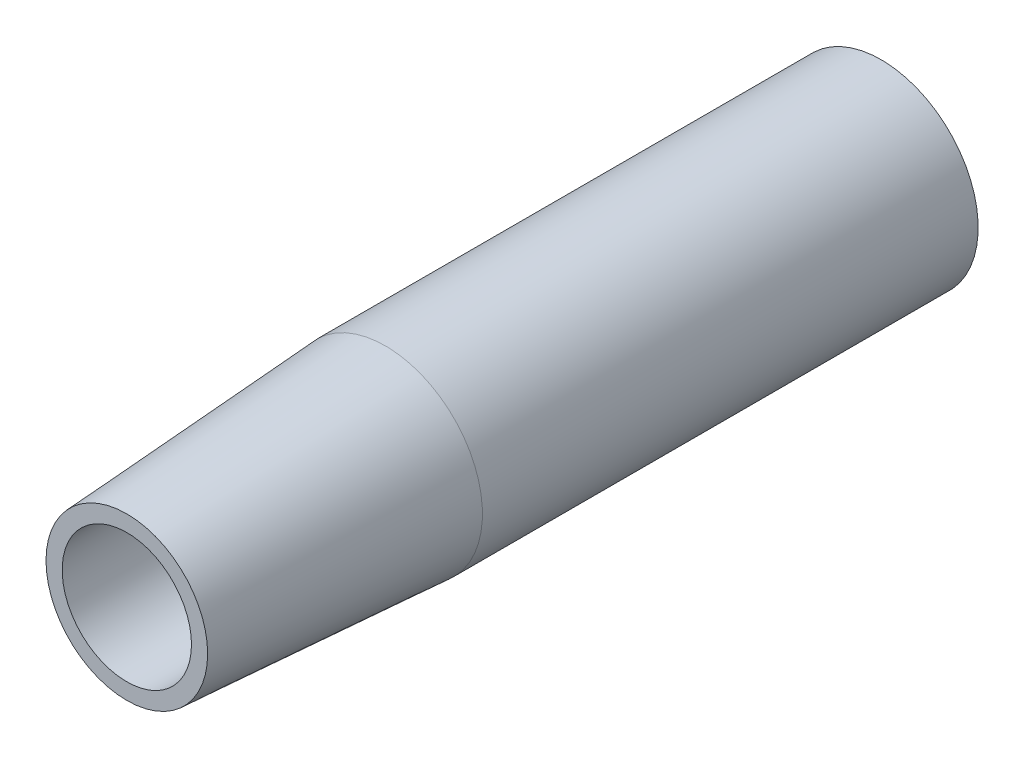
ISO-10303-21;
HEADER;
FILE_DESCRIPTION(('STEP AP214'),'2;1');
FILE_NAME('part.step','',(''),(''),'','','');
FILE_SCHEMA(('AUTOMOTIVE_DESIGN { 1 0 10303 214 1 1 1 1 }'));
ENDSEC;
DATA;
#1=APPLICATION_CONTEXT('core data for automotive mechanical design processes');
#2=APPLICATION_PROTOCOL_DEFINITION('international standard','automotive_design',2000,#1);
#3=PRODUCT_CONTEXT('',#1,'mechanical');
#4=PRODUCT('Part','Part','',(#3));
#5=PRODUCT_RELATED_PRODUCT_CATEGORY('part','',(#4));
#6=PRODUCT_DEFINITION_FORMATION('','',#4);
#7=PRODUCT_DEFINITION_CONTEXT('part definition',#1,'design');
#8=PRODUCT_DEFINITION('design','',#6,#7);
#9=PRODUCT_DEFINITION_SHAPE('','',#8);
#10=(LENGTH_UNIT() NAMED_UNIT(*) SI_UNIT(.MILLI.,.METRE.));
#11=(NAMED_UNIT(*) PLANE_ANGLE_UNIT() SI_UNIT($,.RADIAN.));
#12=(NAMED_UNIT(*) SI_UNIT($,.STERADIAN.) SOLID_ANGLE_UNIT());
#13=UNCERTAINTY_MEASURE_WITH_UNIT(LENGTH_MEASURE(1.E-05),#10,'distance_accuracy_value','');
#14=(GEOMETRIC_REPRESENTATION_CONTEXT(3) GLOBAL_UNCERTAINTY_ASSIGNED_CONTEXT((#13)) GLOBAL_UNIT_ASSIGNED_CONTEXT((#10,
#11,#12)) REPRESENTATION_CONTEXT('',''));
#15=CARTESIAN_POINT('',(0.,0.,0.));
#16=DIRECTION('',(0.,0.,1.));
#17=DIRECTION('',(1.,0.,0.));
#18=AXIS2_PLACEMENT_3D('',#15,#16,#17);
#19=CARTESIAN_POINT('',(0.,0.,77.));
#20=DIRECTION('',(0.,0.,-1.));
#21=DIRECTION('',(-1.,0.,0.));
#22=AXIS2_PLACEMENT_3D('',#19,#20,#21);
#23=CYLINDRICAL_SURFACE('',#22,15.);
#24=CARTESIAN_POINT('',(0.,0.,0.330127018922207));
#25=DIRECTION('',(0.,0.,-1.));
#26=DIRECTION('',(-1.,0.,0.));
#27=AXIS2_PLACEMENT_3D('',#24,#25,#26);
#28=CIRCLE('',#27,15.);
#29=CARTESIAN_POINT('',(-15.,0.,0.330127018922207));
#30=VERTEX_POINT('',#29);
#31=EDGE_CURVE('E40',#30,#30,#28,.F.);
#32=ORIENTED_EDGE('',*,*,#31,.T.);
#33=EDGE_LOOP('',(#32));
#34=FACE_BOUND('',#33,.T.);
#35=CARTESIAN_POINT('',(0.,0.,77.));
#36=DIRECTION('',(0.,0.,-1.));
#37=DIRECTION('',(-1.,0.,0.));
#38=AXIS2_PLACEMENT_3D('',#35,#36,#37);
#39=CIRCLE('',#38,15.);
#40=CARTESIAN_POINT('',(-15.,0.,77.));
#41=VERTEX_POINT('',#40);
#42=EDGE_CURVE('E48',#41,#41,#39,.F.);
#43=ORIENTED_EDGE('',*,*,#42,.F.);
#44=EDGE_LOOP('',(#43));
#45=FACE_BOUND('',#44,.T.);
#46=ADVANCED_FACE('F33',(#34,#45),#23,.T.);
#47=CARTESIAN_POINT('',(0.,0.,117.));
#48=DIRECTION('',(0.,0.,1.));
#49=DIRECTION('',(1.,0.,0.));
#50=AXIS2_PLACEMENT_3D('',#47,#48,#49);
#51=PLANE('',#50);
#52=CARTESIAN_POINT('',(0.,0.,117.));
#53=DIRECTION('',(0.,0.,1.));
#54=DIRECTION('',(1.,0.,0.));
#55=AXIS2_PLACEMENT_3D('',#52,#53,#54);
#56=CIRCLE('',#55,10.);
#57=CARTESIAN_POINT('',(10.,0.,117.));
#58=VERTEX_POINT('',#57);
#59=EDGE_CURVE('E94',#58,#58,#56,.T.);
#60=ORIENTED_EDGE('',*,*,#59,.F.);
#61=EDGE_LOOP('',(#60));
#62=FACE_BOUND('',#61,.T.);
#63=CARTESIAN_POINT('',(0.,0.,117.));
#64=DIRECTION('',(0.,0.,1.));
#65=DIRECTION('',(1.,0.,0.));
#66=AXIS2_PLACEMENT_3D('',#63,#64,#65);
#67=CIRCLE('',#66,12.5);
#68=CARTESIAN_POINT('',(12.5,0.,117.));
#69=VERTEX_POINT('',#68);
#70=EDGE_CURVE('E55',#69,#69,#67,.T.);
#71=ORIENTED_EDGE('',*,*,#70,.T.);
#72=EDGE_LOOP('',(#71));
#73=FACE_BOUND('',#72,.T.);
#74=ADVANCED_FACE('F66',(#62,#73),#51,.T.);
#75=CARTESIAN_POINT('',(0.,0.,117.));
#76=DIRECTION('',(0.,0.,-1.));
#77=DIRECTION('',(-1.,0.,0.));
#78=AXIS2_PLACEMENT_3D('',#75,#76,#77);
#79=CONICAL_SURFACE('',#78,12.5,0.0624188099959574);
#80=ORIENTED_EDGE('',*,*,#70,.F.);
#81=EDGE_LOOP('',(#80));
#82=FACE_BOUND('',#81,.T.);
#83=ORIENTED_EDGE('',*,*,#42,.T.);
#84=EDGE_LOOP('',(#83));
#85=FACE_BOUND('',#84,.T.);
#86=ADVANCED_FACE('F76',(#82,#85),#79,.T.);
#87=CARTESIAN_POINT('',(0.,0.,57.));
#88=DIRECTION('',(0.,0.,1.));
#89=DIRECTION('',(1.,0.,0.));
#90=AXIS2_PLACEMENT_3D('',#87,#88,#89);
#91=CYLINDRICAL_SURFACE('',#90,10.);
#92=CARTESIAN_POINT('',(0.,0.,57.));
#93=DIRECTION('',(0.,0.,1.));
#94=DIRECTION('',(1.,0.,0.));
#95=AXIS2_PLACEMENT_3D('',#92,#93,#94);
#96=CIRCLE('',#95,10.);
#97=CARTESIAN_POINT('',(10.,0.,57.));
#98=VERTEX_POINT('',#97);
#99=EDGE_CURVE('E60',#98,#98,#96,.T.);
#100=ORIENTED_EDGE('',*,*,#99,.F.);
#101=EDGE_LOOP('',(#100));
#102=FACE_BOUND('',#101,.T.);
#103=ORIENTED_EDGE('',*,*,#59,.T.);
#104=EDGE_LOOP('',(#103));
#105=FACE_BOUND('',#104,.T.);
#106=ADVANCED_FACE('F78',(#102,#105),#91,.F.);
#107=CARTESIAN_POINT('',(0.,0.,57.));
#108=DIRECTION('',(0.,0.,1.));
#109=DIRECTION('',(1.,0.,0.));
#110=AXIS2_PLACEMENT_3D('',#107,#108,#109);
#111=PLANE('',#110);
#112=ORIENTED_EDGE('',*,*,#99,.T.);
#113=EDGE_LOOP('',(#112));
#114=FACE_BOUND('',#113,.T.);
#115=ADVANCED_FACE('F107',(#114),#111,.T.);
#116=CARTESIAN_POINT('',(0.,0.,40.5));
#117=DIRECTION('',(0.,0.,-1.));
#118=DIRECTION('',(-1.,0.,0.));
#119=AXIS2_PLACEMENT_3D('',#116,#117,#118);
#120=CYLINDRICAL_SURFACE('',#119,10.);
#121=CARTESIAN_POINT('',(0.,0.,6.06217782649099));
#122=DIRECTION('',(0.,0.,1.));
#123=DIRECTION('',(1.,0.,0.));
#124=AXIS2_PLACEMENT_3D('',#121,#122,#123);
#125=CIRCLE('',#124,10.);
#126=CARTESIAN_POINT('',(10.,0.,6.06217782649099));
#127=VERTEX_POINT('',#126);
#128=EDGE_CURVE('E44',#127,#127,#125,.F.);
#129=ORIENTED_EDGE('',*,*,#128,.T.);
#130=EDGE_LOOP('',(#129));
#131=FACE_BOUND('',#130,.T.);
#132=CARTESIAN_POINT('',(0.,0.,40.5));
#133=DIRECTION('',(0.,0.,-1.));
#134=DIRECTION('',(-1.,0.,0.));
#135=AXIS2_PLACEMENT_3D('',#132,#133,#134);
#136=CIRCLE('',#135,10.);
#137=CARTESIAN_POINT('',(-10.,0.,40.5));
#138=VERTEX_POINT('',#137);
#139=EDGE_CURVE('E97',#138,#138,#136,.T.);
#140=ORIENTED_EDGE('',*,*,#139,.F.);
#141=EDGE_LOOP('',(#140));
#142=FACE_BOUND('',#141,.T.);
#143=ADVANCED_FACE('F105',(#131,#142),#120,.F.);
#144=CARTESIAN_POINT('',(0.,0.,40.5));
#145=DIRECTION('',(0.,0.,-1.));
#146=DIRECTION('',(-1.,0.,0.));
#147=AXIS2_PLACEMENT_3D('',#144,#145,#146);
#148=PLANE('',#147);
#149=ORIENTED_EDGE('',*,*,#139,.T.);
#150=EDGE_LOOP('',(#149));
#151=FACE_BOUND('',#150,.T.);
#152=ADVANCED_FACE('F103',(#151),#148,.T.);
#153=CARTESIAN_POINT('',(0.,0.,6.06217782649099));
#154=DIRECTION('',(0.,0.,-1.));
#155=DIRECTION('',(-1.,0.,0.));
#156=AXIS2_PLACEMENT_3D('',#153,#154,#155);
#157=CONICAL_SURFACE('',#156,10.,0.5235987755983);
#158=CARTESIAN_POINT('',(0.,0.,0.866025403784457));
#159=DIRECTION('',(0.,0.,-1.));
#160=DIRECTION('',(-1.,0.,0.));
#161=AXIS2_PLACEMENT_3D('',#158,#159,#160);
#162=CIRCLE('',#161,13.);
#163=CARTESIAN_POINT('',(-13.,0.,0.866025403784457));
#164=VERTEX_POINT('',#163);
#165=EDGE_CURVE('E11',#164,#164,#162,.T.);
#166=ORIENTED_EDGE('',*,*,#165,.T.);
#167=EDGE_LOOP('',(#166));
#168=FACE_BOUND('',#167,.T.);
#169=ORIENTED_EDGE('',*,*,#128,.F.);
#170=EDGE_LOOP('',(#169));
#171=FACE_BOUND('',#170,.T.);
#172=ADVANCED_FACE('F114',(#168,#171),#157,.F.);
#173=CARTESIAN_POINT('',(0.,0.,0.));
#174=DIRECTION('',(0.,0.,-1.));
#175=DIRECTION('',(-1.,0.,0.));
#176=AXIS2_PLACEMENT_3D('',#173,#174,#175);
#177=CONICAL_SURFACE('',#176,16.232050807569,1.30899693899575);
#178=ORIENTED_EDGE('',*,*,#165,.F.);
#179=EDGE_LOOP('',(#178));
#180=FACE_BOUND('',#179,.T.);
#181=ORIENTED_EDGE('',*,*,#31,.F.);
#182=EDGE_LOOP('',(#181));
#183=FACE_BOUND('',#182,.T.);
#184=ADVANCED_FACE('F35',(#180,#183),#177,.F.);
#185=CLOSED_SHELL('',(#46,#74,#86,#106,#115,#143,#152,#172,#184));
#186=MANIFOLD_SOLID_BREP('B2',#185);
#187=ADVANCED_BREP_SHAPE_REPRESENTATION('',(#18,#186),#14);
#188=SHAPE_DEFINITION_REPRESENTATION(#9,#187);
ENDSEC;
END-ISO-10303-21;
